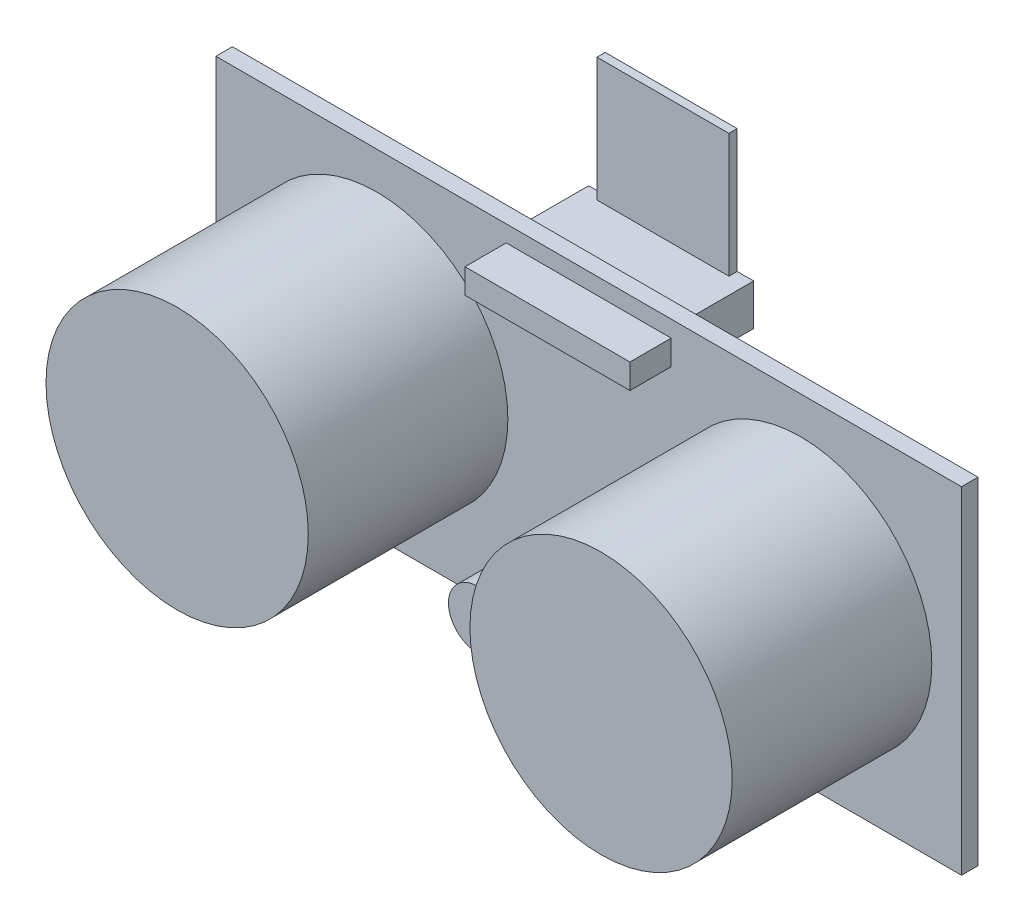
ISO-10303-21;
HEADER;
FILE_DESCRIPTION(('STEP AP214'),'2;1');
FILE_NAME('part.step','',(''),(''),'','','');
FILE_SCHEMA(('AUTOMOTIVE_DESIGN { 1 0 10303 214 1 1 1 1 }'));
ENDSEC;
DATA;
#1=APPLICATION_CONTEXT('core data for automotive mechanical design processes');
#2=APPLICATION_PROTOCOL_DEFINITION('international standard','automotive_design',2000,#1);
#3=PRODUCT_CONTEXT('',#1,'mechanical');
#4=PRODUCT('Part','Part','',(#3));
#5=PRODUCT_RELATED_PRODUCT_CATEGORY('part','',(#4));
#6=PRODUCT_DEFINITION_FORMATION('','',#4);
#7=PRODUCT_DEFINITION_CONTEXT('part definition',#1,'design');
#8=PRODUCT_DEFINITION('design','',#6,#7);
#9=PRODUCT_DEFINITION_SHAPE('','',#8);
#10=(LENGTH_UNIT() NAMED_UNIT(*) SI_UNIT(.MILLI.,.METRE.));
#11=(NAMED_UNIT(*) PLANE_ANGLE_UNIT() SI_UNIT($,.RADIAN.));
#12=(NAMED_UNIT(*) SI_UNIT($,.STERADIAN.) SOLID_ANGLE_UNIT());
#13=UNCERTAINTY_MEASURE_WITH_UNIT(LENGTH_MEASURE(1.E-05),#10,'distance_accuracy_value','');
#14=(GEOMETRIC_REPRESENTATION_CONTEXT(3) GLOBAL_UNCERTAINTY_ASSIGNED_CONTEXT((#13)) GLOBAL_UNIT_ASSIGNED_CONTEXT((#10,
#11,#12)) REPRESENTATION_CONTEXT('',''));
#15=CARTESIAN_POINT('',(0.,0.,0.));
#16=DIRECTION('',(0.,0.,1.));
#17=DIRECTION('',(1.,0.,0.));
#18=AXIS2_PLACEMENT_3D('',#15,#16,#17);
#19=CARTESIAN_POINT('',(0.,0.,1.));
#20=DIRECTION('',(0.,0.,-1.));
#21=DIRECTION('',(-1.,0.,0.));
#22=AXIS2_PLACEMENT_3D('',#19,#20,#21);
#23=PLANE('',#22);
#24=DIRECTION('',(1.,0.,0.));
#25=VECTOR('',#24,1.);
#26=CARTESIAN_POINT('',(27.6,0.500000000000007,1.));
#27=LINE('',#26,#25);
#28=CARTESIAN_POINT('',(19.35,0.500000000000006,1.));
#29=VERTEX_POINT('',#28);
#30=CARTESIAN_POINT('',(25.85,0.500000000000007,1.));
#31=VERTEX_POINT('',#30);
#32=EDGE_CURVE('E315',#29,#31,#27,.T.);
#33=ORIENTED_EDGE('',*,*,#32,.F.);
#34=CARTESIAN_POINT('',(19.35,2.25000000000001,1.));
#35=DIRECTION('',(0.,0.,-1.));
#36=DIRECTION('',(-1.,0.,0.));
#37=AXIS2_PLACEMENT_3D('',#34,#35,#36);
#38=CIRCLE('',#37,1.75);
#39=CARTESIAN_POINT('',(17.6,2.25000000000001,1.));
#40=VERTEX_POINT('',#39);
#41=EDGE_CURVE('E11',#29,#40,#38,.T.);
#42=ORIENTED_EDGE('',*,*,#41,.T.);
#43=CARTESIAN_POINT('',(19.35,2.25000000000001,1.));
#44=DIRECTION('',(0.,0.,-1.));
#45=DIRECTION('',(-1.,0.,0.));
#46=AXIS2_PLACEMENT_3D('',#43,#44,#45);
#47=CIRCLE('',#46,1.75);
#48=CARTESIAN_POINT('',(19.35,4.00000000000001,1.));
#49=VERTEX_POINT('',#48);
#50=EDGE_CURVE('E54',#40,#49,#47,.T.);
#51=ORIENTED_EDGE('',*,*,#50,.T.);
#52=DIRECTION('',(-1.,0.,0.));
#53=VECTOR('',#52,1.);
#54=CARTESIAN_POINT('',(27.6,4.00000000000001,1.));
#55=LINE('',#54,#53);
#56=CARTESIAN_POINT('',(25.85,4.00000000000001,1.));
#57=VERTEX_POINT('',#56);
#58=EDGE_CURVE('E310',#57,#49,#55,.T.);
#59=ORIENTED_EDGE('',*,*,#58,.F.);
#60=CARTESIAN_POINT('',(25.85,2.25000000000001,1.));
#61=DIRECTION('',(0.,0.,-1.));
#62=DIRECTION('',(-1.,0.,0.));
#63=AXIS2_PLACEMENT_3D('',#60,#61,#62);
#64=CIRCLE('',#63,1.75);
#65=CARTESIAN_POINT('',(27.6,2.25000000000001,1.));
#66=VERTEX_POINT('',#65);
#67=EDGE_CURVE('E409',#57,#66,#64,.T.);
#68=ORIENTED_EDGE('',*,*,#67,.T.);
#69=CARTESIAN_POINT('',(25.85,2.25000000000001,1.));
#70=DIRECTION('',(0.,0.,-1.));
#71=DIRECTION('',(-1.,0.,0.));
#72=AXIS2_PLACEMENT_3D('',#69,#70,#71);
#73=CIRCLE('',#72,1.75);
#74=EDGE_CURVE('E406',#66,#31,#73,.T.);
#75=ORIENTED_EDGE('',*,*,#74,.T.);
#76=EDGE_LOOP('',(#33,#42,#51,#59,#68,#75));
#77=FACE_BOUND('',#76,.T.);
#78=CARTESIAN_POINT('',(35.45,10.2,1.));
#79=DIRECTION('',(0.,0.,-1.));
#80=DIRECTION('',(-1.,0.,0.));
#81=AXIS2_PLACEMENT_3D('',#78,#79,#80);
#82=CIRCLE('',#81,7.95);
#83=CARTESIAN_POINT('',(27.5,10.2,1.));
#84=VERTEX_POINT('',#83);
#85=EDGE_CURVE('E376',#84,#84,#82,.F.);
#86=ORIENTED_EDGE('',*,*,#85,.F.);
#87=EDGE_LOOP('',(#86));
#88=FACE_BOUND('',#87,.T.);
#89=CARTESIAN_POINT('',(9.75,10.2,1.));
#90=DIRECTION('',(0.,0.,-1.));
#91=DIRECTION('',(-1.,0.,0.));
#92=AXIS2_PLACEMENT_3D('',#89,#90,#91);
#93=CIRCLE('',#92,7.95);
#94=CARTESIAN_POINT('',(1.8,10.2,1.));
#95=VERTEX_POINT('',#94);
#96=EDGE_CURVE('E372',#95,#95,#93,.F.);
#97=ORIENTED_EDGE('',*,*,#96,.F.);
#98=EDGE_LOOP('',(#97));
#99=FACE_BOUND('',#98,.T.);
#100=DIRECTION('',(0.,-1.,0.));
#101=VECTOR('',#100,1.);
#102=CARTESIAN_POINT('',(0.,0.,1.));
#103=LINE('',#102,#101);
#104=CARTESIAN_POINT('',(0.,20.4,1.));
#105=VERTEX_POINT('',#104);
#106=CARTESIAN_POINT('',(0.,0.,1.));
#107=VERTEX_POINT('',#106);
#108=EDGE_CURVE('E331',#105,#107,#103,.T.);
#109=ORIENTED_EDGE('',*,*,#108,.T.);
#110=DIRECTION('',(1.,0.,0.));
#111=VECTOR('',#110,1.);
#112=CARTESIAN_POINT('',(0.,0.,1.));
#113=LINE('',#112,#111);
#114=CARTESIAN_POINT('',(45.2,0.,1.));
#115=VERTEX_POINT('',#114);
#116=EDGE_CURVE('E335',#107,#115,#113,.T.);
#117=ORIENTED_EDGE('',*,*,#116,.T.);
#118=DIRECTION('',(0.,1.,0.));
#119=VECTOR('',#118,1.);
#120=CARTESIAN_POINT('',(45.2,0.,1.));
#121=LINE('',#120,#119);
#122=CARTESIAN_POINT('',(45.2,20.4,1.));
#123=VERTEX_POINT('',#122);
#124=EDGE_CURVE('E339',#115,#123,#121,.T.);
#125=ORIENTED_EDGE('',*,*,#124,.T.);
#126=DIRECTION('',(-1.,0.,0.));
#127=VECTOR('',#126,1.);
#128=CARTESIAN_POINT('',(0.,20.4,1.));
#129=LINE('',#128,#127);
#130=EDGE_CURVE('E342',#123,#105,#129,.T.);
#131=ORIENTED_EDGE('',*,*,#130,.T.);
#132=EDGE_LOOP('',(#109,#117,#125,#131));
#133=FACE_BOUND('',#132,.T.);
#134=DIRECTION('',(0.,1.,0.));
#135=VECTOR('',#134,1.);
#136=CARTESIAN_POINT('',(27.6,19.4,1.));
#137=LINE('',#136,#135);
#138=CARTESIAN_POINT('',(27.6,17.9,1.));
#139=VERTEX_POINT('',#138);
#140=CARTESIAN_POINT('',(27.6,19.4,1.));
#141=VERTEX_POINT('',#140);
#142=EDGE_CURVE('E217',#139,#141,#137,.T.);
#143=ORIENTED_EDGE('',*,*,#142,.F.);
#144=DIRECTION('',(1.,0.,0.));
#145=VECTOR('',#144,1.);
#146=CARTESIAN_POINT('',(17.6,17.9,1.));
#147=LINE('',#146,#145);
#148=CARTESIAN_POINT('',(17.6,17.9,1.));
#149=VERTEX_POINT('',#148);
#150=EDGE_CURVE('E214',#149,#139,#147,.T.);
#151=ORIENTED_EDGE('',*,*,#150,.F.);
#152=DIRECTION('',(0.,-1.,0.));
#153=VECTOR('',#152,1.);
#154=CARTESIAN_POINT('',(17.6,19.4,1.));
#155=LINE('',#154,#153);
#156=CARTESIAN_POINT('',(17.6,19.4,1.));
#157=VERTEX_POINT('',#156);
#158=EDGE_CURVE('E67',#157,#149,#155,.T.);
#159=ORIENTED_EDGE('',*,*,#158,.F.);
#160=DIRECTION('',(-1.,0.,0.));
#161=VECTOR('',#160,1.);
#162=CARTESIAN_POINT('',(17.6,19.4,1.));
#163=LINE('',#162,#161);
#164=EDGE_CURVE('E62',#141,#157,#163,.T.);
#165=ORIENTED_EDGE('',*,*,#164,.F.);
#166=EDGE_LOOP('',(#143,#151,#159,#165));
#167=FACE_BOUND('',#166,.T.);
#168=ADVANCED_FACE('F44',(#77,#88,#99,#133,#167),#23,.F.);
#169=CARTESIAN_POINT('',(27.6,19.9014399541796,-4.));
#170=DIRECTION('',(0.,-1.,0.));
#171=DIRECTION('',(0.,0.,-1.));
#172=AXIS2_PLACEMENT_3D('',#169,#170,#171);
#173=PLANE('',#172);
#174=DIRECTION('',(0.,0.,-1.));
#175=VECTOR('',#174,1.);
#176=CARTESIAN_POINT('',(26.6,19.9014399541796,-3.5));
#177=LINE('',#176,#175);
#178=CARTESIAN_POINT('',(26.6,19.9014399541796,-3.5));
#179=VERTEX_POINT('',#178);
#180=CARTESIAN_POINT('',(26.6,19.9014399541796,-4.));
#181=VERTEX_POINT('',#180);
#182=EDGE_CURVE('E219',#179,#181,#177,.T.);
#183=ORIENTED_EDGE('',*,*,#182,.F.);
#184=DIRECTION('',(1.,0.,0.));
#185=VECTOR('',#184,1.);
#186=CARTESIAN_POINT('',(18.6,19.9014399541796,-3.5));
#187=LINE('',#186,#185);
#188=CARTESIAN_POINT('',(18.6,19.9014399541796,-3.5));
#189=VERTEX_POINT('',#188);
#190=EDGE_CURVE('E234',#189,#179,#187,.T.);
#191=ORIENTED_EDGE('',*,*,#190,.F.);
#192=DIRECTION('',(0.,0.,1.));
#193=VECTOR('',#192,1.);
#194=CARTESIAN_POINT('',(18.6,19.9014399541796,-3.5));
#195=LINE('',#194,#193);
#196=CARTESIAN_POINT('',(18.6,19.9014399541796,-4.));
#197=VERTEX_POINT('',#196);
#198=EDGE_CURVE('E223',#197,#189,#195,.T.);
#199=ORIENTED_EDGE('',*,*,#198,.F.);
#200=DIRECTION('',(1.,0.,0.));
#201=VECTOR('',#200,1.);
#202=CARTESIAN_POINT('',(27.6,19.9014399541796,-4.));
#203=LINE('',#202,#201);
#204=CARTESIAN_POINT('',(17.6,19.9014399541796,-4.));
#205=VERTEX_POINT('',#204);
#206=EDGE_CURVE('E269',#205,#197,#203,.T.);
#207=ORIENTED_EDGE('',*,*,#206,.F.);
#208=DIRECTION('',(0.,0.,1.));
#209=VECTOR('',#208,1.);
#210=CARTESIAN_POINT('',(17.6,19.9014399541796,-4.));
#211=LINE('',#210,#209);
#212=CARTESIAN_POINT('',(17.6,19.9014399541796,0.));
#213=VERTEX_POINT('',#212);
#214=EDGE_CURVE('E302',#205,#213,#211,.T.);
#215=ORIENTED_EDGE('',*,*,#214,.T.);
#216=DIRECTION('',(1.,0.,0.));
#217=VECTOR('',#216,1.);
#218=CARTESIAN_POINT('',(27.6,19.9014399541796,0.));
#219=LINE('',#218,#217);
#220=CARTESIAN_POINT('',(27.6,19.9014399541796,0.));
#221=VERTEX_POINT('',#220);
#222=EDGE_CURVE('E283',#213,#221,#219,.T.);
#223=ORIENTED_EDGE('',*,*,#222,.T.);
#224=DIRECTION('',(0.,0.,1.));
#225=VECTOR('',#224,1.);
#226=CARTESIAN_POINT('',(27.6,19.9014399541796,-4.));
#227=LINE('',#226,#225);
#228=CARTESIAN_POINT('',(27.6,19.9014399541796,-4.));
#229=VERTEX_POINT('',#228);
#230=EDGE_CURVE('E298',#229,#221,#227,.T.);
#231=ORIENTED_EDGE('',*,*,#230,.F.);
#232=EDGE_CURVE('E267',#181,#229,#203,.T.);
#233=ORIENTED_EDGE('',*,*,#232,.F.);
#234=EDGE_LOOP('',(#183,#191,#199,#207,#215,#223,#231,#233));
#235=FACE_BOUND('',#234,.T.);
#236=ADVANCED_FACE('F449',(#235),#173,.F.);
#237=CARTESIAN_POINT('',(0.,0.,0.));
#238=DIRECTION('',(0.,0.,-1.));
#239=DIRECTION('',(-1.,0.,0.));
#240=AXIS2_PLACEMENT_3D('',#237,#238,#239);
#241=PLANE('',#240);
#242=DIRECTION('',(0.,-1.,0.));
#243=VECTOR('',#242,1.);
#244=CARTESIAN_POINT('',(0.,0.,0.));
#245=LINE('',#244,#243);
#246=CARTESIAN_POINT('',(0.,20.4,0.));
#247=VERTEX_POINT('',#246);
#248=CARTESIAN_POINT('',(0.,0.,0.));
#249=VERTEX_POINT('',#248);
#250=EDGE_CURVE('E330',#247,#249,#245,.T.);
#251=ORIENTED_EDGE('',*,*,#250,.F.);
#252=DIRECTION('',(-1.,0.,0.));
#253=VECTOR('',#252,1.);
#254=CARTESIAN_POINT('',(0.,20.4,0.));
#255=LINE('',#254,#253);
#256=CARTESIAN_POINT('',(45.2,20.4,0.));
#257=VERTEX_POINT('',#256);
#258=EDGE_CURVE('E336',#257,#247,#255,.T.);
#259=ORIENTED_EDGE('',*,*,#258,.F.);
#260=DIRECTION('',(0.,1.,0.));
#261=VECTOR('',#260,1.);
#262=CARTESIAN_POINT('',(45.2,0.,0.));
#263=LINE('',#262,#261);
#264=CARTESIAN_POINT('',(45.2,0.,0.));
#265=VERTEX_POINT('',#264);
#266=EDGE_CURVE('E352',#265,#257,#263,.T.);
#267=ORIENTED_EDGE('',*,*,#266,.F.);
#268=DIRECTION('',(1.,0.,0.));
#269=VECTOR('',#268,1.);
#270=CARTESIAN_POINT('',(0.,0.,0.));
#271=LINE('',#270,#269);
#272=EDGE_CURVE('E349',#249,#265,#271,.T.);
#273=ORIENTED_EDGE('',*,*,#272,.F.);
#274=EDGE_LOOP('',(#251,#259,#267,#273));
#275=FACE_BOUND('',#274,.T.);
#276=ORIENTED_EDGE('',*,*,#222,.F.);
#277=DIRECTION('',(0.,1.,0.));
#278=VECTOR('',#277,1.);
#279=CARTESIAN_POINT('',(17.6,19.9014399541796,0.));
#280=LINE('',#279,#278);
#281=CARTESIAN_POINT('',(17.6,17.4014399541796,0.));
#282=VERTEX_POINT('',#281);
#283=EDGE_CURVE('E262',#282,#213,#280,.T.);
#284=ORIENTED_EDGE('',*,*,#283,.F.);
#285=DIRECTION('',(-1.,0.,0.));
#286=VECTOR('',#285,1.);
#287=CARTESIAN_POINT('',(27.6,17.4014399541796,0.));
#288=LINE('',#287,#286);
#289=CARTESIAN_POINT('',(27.6,17.4014399541796,0.));
#290=VERTEX_POINT('',#289);
#291=EDGE_CURVE('E268',#290,#282,#288,.T.);
#292=ORIENTED_EDGE('',*,*,#291,.F.);
#293=DIRECTION('',(0.,-1.,0.));
#294=VECTOR('',#293,1.);
#295=CARTESIAN_POINT('',(27.6,19.9014399541796,0.));
#296=LINE('',#295,#294);
#297=EDGE_CURVE('E286',#221,#290,#296,.T.);
#298=ORIENTED_EDGE('',*,*,#297,.F.);
#299=EDGE_LOOP('',(#276,#284,#292,#298));
#300=FACE_BOUND('',#299,.T.);
#301=ADVANCED_FACE('F523',(#275,#300),#241,.T.);
#302=CARTESIAN_POINT('',(0.,0.,1.));
#303=DIRECTION('',(1.,0.,0.));
#304=DIRECTION('',(0.,0.,-1.));
#305=AXIS2_PLACEMENT_3D('',#302,#303,#304);
#306=PLANE('',#305);
#307=ORIENTED_EDGE('',*,*,#250,.T.);
#308=DIRECTION('',(0.,0.,-1.));
#309=VECTOR('',#308,1.);
#310=CARTESIAN_POINT('',(0.,0.,1.));
#311=LINE('',#310,#309);
#312=EDGE_CURVE('E368',#107,#249,#311,.T.);
#313=ORIENTED_EDGE('',*,*,#312,.F.);
#314=ORIENTED_EDGE('',*,*,#108,.F.);
#315=DIRECTION('',(0.,0.,-1.));
#316=VECTOR('',#315,1.);
#317=CARTESIAN_POINT('',(0.,20.4,1.));
#318=LINE('',#317,#316);
#319=EDGE_CURVE('E345',#105,#247,#318,.T.);
#320=ORIENTED_EDGE('',*,*,#319,.T.);
#321=EDGE_LOOP('',(#307,#313,#314,#320));
#322=FACE_BOUND('',#321,.T.);
#323=ADVANCED_FACE('F553',(#322),#306,.F.);
#324=CARTESIAN_POINT('',(0.,0.,1.));
#325=DIRECTION('',(0.,1.,0.));
#326=DIRECTION('',(0.,0.,1.));
#327=AXIS2_PLACEMENT_3D('',#324,#325,#326);
#328=PLANE('',#327);
#329=ORIENTED_EDGE('',*,*,#272,.T.);
#330=DIRECTION('',(0.,0.,-1.));
#331=VECTOR('',#330,1.);
#332=CARTESIAN_POINT('',(45.2,0.,1.));
#333=LINE('',#332,#331);
#334=EDGE_CURVE('E364',#115,#265,#333,.T.);
#335=ORIENTED_EDGE('',*,*,#334,.F.);
#336=ORIENTED_EDGE('',*,*,#116,.F.);
#337=ORIENTED_EDGE('',*,*,#312,.T.);
#338=EDGE_LOOP('',(#329,#335,#336,#337));
#339=FACE_BOUND('',#338,.T.);
#340=ADVANCED_FACE('F561',(#339),#328,.F.);
#341=CARTESIAN_POINT('',(45.2,0.,1.));
#342=DIRECTION('',(-1.,0.,0.));
#343=DIRECTION('',(0.,0.,1.));
#344=AXIS2_PLACEMENT_3D('',#341,#342,#343);
#345=PLANE('',#344);
#346=ORIENTED_EDGE('',*,*,#266,.T.);
#347=DIRECTION('',(0.,0.,-1.));
#348=VECTOR('',#347,1.);
#349=CARTESIAN_POINT('',(45.2,20.4,1.));
#350=LINE('',#349,#348);
#351=EDGE_CURVE('E360',#123,#257,#350,.T.);
#352=ORIENTED_EDGE('',*,*,#351,.F.);
#353=ORIENTED_EDGE('',*,*,#124,.F.);
#354=ORIENTED_EDGE('',*,*,#334,.T.);
#355=EDGE_LOOP('',(#346,#352,#353,#354));
#356=FACE_BOUND('',#355,.T.);
#357=ADVANCED_FACE('F557',(#356),#345,.F.);
#358=CARTESIAN_POINT('',(0.,20.4,1.));
#359=DIRECTION('',(0.,-1.,0.));
#360=DIRECTION('',(0.,0.,-1.));
#361=AXIS2_PLACEMENT_3D('',#358,#359,#360);
#362=PLANE('',#361);
#363=ORIENTED_EDGE('',*,*,#258,.T.);
#364=ORIENTED_EDGE('',*,*,#319,.F.);
#365=ORIENTED_EDGE('',*,*,#130,.F.);
#366=ORIENTED_EDGE('',*,*,#351,.T.);
#367=EDGE_LOOP('',(#363,#364,#365,#366));
#368=FACE_BOUND('',#367,.T.);
#369=ADVANCED_FACE('F548',(#368),#362,.F.);
#370=CARTESIAN_POINT('',(9.75,10.2,13.1));
#371=DIRECTION('',(0.,0.,-1.));
#372=DIRECTION('',(-1.,0.,0.));
#373=AXIS2_PLACEMENT_3D('',#370,#371,#372);
#374=CYLINDRICAL_SURFACE('',#373,7.95);
#375=CARTESIAN_POINT('',(9.75,10.2,13.1));
#376=DIRECTION('',(0.,0.,1.));
#377=DIRECTION('',(1.,0.,0.));
#378=AXIS2_PLACEMENT_3D('',#375,#376,#377);
#379=CIRCLE('',#378,7.95);
#380=CARTESIAN_POINT('',(17.7,10.2,13.1));
#381=VERTEX_POINT('',#380);
#382=EDGE_CURVE('E326',#381,#381,#379,.T.);
#383=ORIENTED_EDGE('',*,*,#382,.F.);
#384=EDGE_LOOP('',(#383));
#385=FACE_BOUND('',#384,.T.);
#386=ORIENTED_EDGE('',*,*,#96,.T.);
#387=EDGE_LOOP('',(#386));
#388=FACE_BOUND('',#387,.T.);
#389=ADVANCED_FACE('F545',(#385,#388),#374,.T.);
#390=CARTESIAN_POINT('',(9.75,10.2,13.1));
#391=DIRECTION('',(0.,0.,1.));
#392=DIRECTION('',(1.,0.,0.));
#393=AXIS2_PLACEMENT_3D('',#390,#391,#392);
#394=PLANE('',#393);
#395=ORIENTED_EDGE('',*,*,#382,.T.);
#396=EDGE_LOOP('',(#395));
#397=FACE_BOUND('',#396,.T.);
#398=ADVANCED_FACE('F538',(#397),#394,.T.);
#399=CARTESIAN_POINT('',(35.45,10.2,13.1));
#400=DIRECTION('',(0.,0.,-1.));
#401=DIRECTION('',(-1.,0.,0.));
#402=AXIS2_PLACEMENT_3D('',#399,#400,#401);
#403=CYLINDRICAL_SURFACE('',#402,7.95);
#404=CARTESIAN_POINT('',(35.45,10.2,13.1));
#405=DIRECTION('',(0.,0.,1.));
#406=DIRECTION('',(-1.,0.,0.));
#407=AXIS2_PLACEMENT_3D('',#404,#405,#406);
#408=CIRCLE('',#407,7.95);
#409=CARTESIAN_POINT('',(27.5,10.2,13.1));
#410=VERTEX_POINT('',#409);
#411=EDGE_CURVE('E314',#410,#410,#408,.T.);
#412=ORIENTED_EDGE('',*,*,#411,.F.);
#413=EDGE_LOOP('',(#412));
#414=FACE_BOUND('',#413,.T.);
#415=ORIENTED_EDGE('',*,*,#85,.T.);
#416=EDGE_LOOP('',(#415));
#417=FACE_BOUND('',#416,.T.);
#418=ADVANCED_FACE('F535',(#414,#417),#403,.T.);
#419=CARTESIAN_POINT('',(35.45,10.2,13.1));
#420=DIRECTION('',(0.,0.,-1.));
#421=DIRECTION('',(-1.,0.,0.));
#422=AXIS2_PLACEMENT_3D('',#419,#420,#421);
#423=PLANE('',#422);
#424=ORIENTED_EDGE('',*,*,#411,.T.);
#425=EDGE_LOOP('',(#424));
#426=FACE_BOUND('',#425,.T.);
#427=ADVANCED_FACE('F534',(#426),#423,.F.);
#428=CARTESIAN_POINT('',(27.6,0.500000000000007,4.5));
#429=DIRECTION('',(0.,1.,0.));
#430=DIRECTION('',(-1.,0.,0.));
#431=AXIS2_PLACEMENT_3D('',#428,#429,#430);
#432=PLANE('',#431);
#433=ORIENTED_EDGE('',*,*,#32,.T.);
#434=DIRECTION('',(0.,0.,-1.));
#435=VECTOR('',#434,1.);
#436=CARTESIAN_POINT('',(25.85,0.500000000000007,4.5));
#437=LINE('',#436,#435);
#438=CARTESIAN_POINT('',(25.85,0.500000000000007,4.5));
#439=VERTEX_POINT('',#438);
#440=EDGE_CURVE('E383',#31,#439,#437,.F.);
#441=ORIENTED_EDGE('',*,*,#440,.T.);
#442=DIRECTION('',(1.,0.,0.));
#443=VECTOR('',#442,1.);
#444=CARTESIAN_POINT('',(27.6,0.500000000000007,4.5));
#445=LINE('',#444,#443);
#446=CARTESIAN_POINT('',(19.35,0.500000000000006,4.5));
#447=VERTEX_POINT('',#446);
#448=EDGE_CURVE('E305',#447,#439,#445,.T.);
#449=ORIENTED_EDGE('',*,*,#448,.F.);
#450=DIRECTION('',(0.,0.,-1.));
#451=VECTOR('',#450,1.);
#452=CARTESIAN_POINT('',(19.35,0.500000000000006,4.5));
#453=LINE('',#452,#451);
#454=EDGE_CURVE('E380',#447,#29,#453,.T.);
#455=ORIENTED_EDGE('',*,*,#454,.T.);
#456=EDGE_LOOP('',(#433,#441,#449,#455));
#457=FACE_BOUND('',#456,.T.);
#458=ADVANCED_FACE('F433',(#457),#432,.F.);
#459=CARTESIAN_POINT('',(27.6,4.00000000000001,4.5));
#460=DIRECTION('',(0.,-1.,0.));
#461=DIRECTION('',(1.,0.,0.));
#462=AXIS2_PLACEMENT_3D('',#459,#460,#461);
#463=PLANE('',#462);
#464=DIRECTION('',(-1.,0.,0.));
#465=VECTOR('',#464,1.);
#466=CARTESIAN_POINT('',(27.6,4.00000000000001,4.5));
#467=LINE('',#466,#465);
#468=CARTESIAN_POINT('',(25.85,4.00000000000001,4.5));
#469=VERTEX_POINT('',#468);
#470=CARTESIAN_POINT('',(19.35,4.00000000000001,4.5));
#471=VERTEX_POINT('',#470);
#472=EDGE_CURVE('E309',#469,#471,#467,.T.);
#473=ORIENTED_EDGE('',*,*,#472,.F.);
#474=DIRECTION('',(0.,0.,-1.));
#475=VECTOR('',#474,1.);
#476=CARTESIAN_POINT('',(25.85,4.00000000000001,4.5));
#477=LINE('',#476,#475);
#478=EDGE_CURVE('E403',#469,#57,#477,.T.);
#479=ORIENTED_EDGE('',*,*,#478,.T.);
#480=ORIENTED_EDGE('',*,*,#58,.T.);
#481=DIRECTION('',(0.,0.,-1.));
#482=VECTOR('',#481,1.);
#483=CARTESIAN_POINT('',(19.35,4.00000000000001,4.5));
#484=LINE('',#483,#482);
#485=EDGE_CURVE('E399',#49,#471,#484,.F.);
#486=ORIENTED_EDGE('',*,*,#485,.T.);
#487=EDGE_LOOP('',(#473,#479,#480,#486));
#488=FACE_BOUND('',#487,.T.);
#489=ADVANCED_FACE('F445',(#488),#463,.F.);
#490=CARTESIAN_POINT('',(0.,0.,4.5));
#491=DIRECTION('',(0.,0.,1.));
#492=DIRECTION('',(1.,0.,0.));
#493=AXIS2_PLACEMENT_3D('',#490,#491,#492);
#494=PLANE('',#493);
#495=ORIENTED_EDGE('',*,*,#448,.T.);
#496=CARTESIAN_POINT('',(25.85,2.25000000000001,4.5));
#497=DIRECTION('',(0.,0.,1.));
#498=DIRECTION('',(1.,0.,0.));
#499=AXIS2_PLACEMENT_3D('',#496,#497,#498);
#500=CIRCLE('',#499,1.75);
#501=CARTESIAN_POINT('',(27.6,2.25000000000001,4.5));
#502=VERTEX_POINT('',#501);
#503=EDGE_CURVE('E396',#439,#502,#500,.T.);
#504=ORIENTED_EDGE('',*,*,#503,.T.);
#505=CARTESIAN_POINT('',(25.85,2.25000000000001,4.5));
#506=DIRECTION('',(0.,0.,1.));
#507=DIRECTION('',(1.,0.,0.));
#508=AXIS2_PLACEMENT_3D('',#505,#506,#507);
#509=CIRCLE('',#508,1.75);
#510=EDGE_CURVE('E393',#502,#469,#509,.T.);
#511=ORIENTED_EDGE('',*,*,#510,.T.);
#512=ORIENTED_EDGE('',*,*,#472,.T.);
#513=CARTESIAN_POINT('',(19.35,2.25000000000001,4.5));
#514=DIRECTION('',(0.,0.,1.));
#515=DIRECTION('',(1.,0.,0.));
#516=AXIS2_PLACEMENT_3D('',#513,#514,#515);
#517=CIRCLE('',#516,1.75);
#518=CARTESIAN_POINT('',(17.6,2.25000000000001,4.5));
#519=VERTEX_POINT('',#518);
#520=EDGE_CURVE('E390',#471,#519,#517,.T.);
#521=ORIENTED_EDGE('',*,*,#520,.T.);
#522=CARTESIAN_POINT('',(19.35,2.25000000000001,4.5));
#523=DIRECTION('',(0.,0.,1.));
#524=DIRECTION('',(1.,0.,0.));
#525=AXIS2_PLACEMENT_3D('',#522,#523,#524);
#526=CIRCLE('',#525,1.75);
#527=EDGE_CURVE('E387',#519,#447,#526,.T.);
#528=ORIENTED_EDGE('',*,*,#527,.T.);
#529=EDGE_LOOP('',(#495,#504,#511,#512,#521,#528));
#530=FACE_BOUND('',#529,.T.);
#531=ADVANCED_FACE('F431',(#530),#494,.T.);
#532=CARTESIAN_POINT('',(25.85,2.25000000000001,4.5));
#533=DIRECTION('',(0.,0.,-1.));
#534=DIRECTION('',(-1.,0.,0.));
#535=AXIS2_PLACEMENT_3D('',#532,#533,#534);
#536=CYLINDRICAL_SURFACE('',#535,1.75);
#537=ORIENTED_EDGE('',*,*,#478,.F.);
#538=ORIENTED_EDGE('',*,*,#510,.F.);
#539=DIRECTION('',(0.,0.,-1.));
#540=VECTOR('',#539,1.);
#541=CARTESIAN_POINT('',(27.6,2.25000000000001,4.5));
#542=LINE('',#541,#540);
#543=EDGE_CURVE('E319',#66,#502,#542,.F.);
#544=ORIENTED_EDGE('',*,*,#543,.F.);
#545=ORIENTED_EDGE('',*,*,#67,.F.);
#546=EDGE_LOOP('',(#537,#538,#544,#545));
#547=FACE_BOUND('',#546,.T.);
#548=ADVANCED_FACE('F441',(#547),#536,.T.);
#549=CARTESIAN_POINT('',(25.85,2.25000000000001,4.5));
#550=DIRECTION('',(0.,0.,-1.));
#551=DIRECTION('',(-1.,0.,0.));
#552=AXIS2_PLACEMENT_3D('',#549,#550,#551);
#553=CYLINDRICAL_SURFACE('',#552,1.75);
#554=ORIENTED_EDGE('',*,*,#503,.F.);
#555=ORIENTED_EDGE('',*,*,#440,.F.);
#556=ORIENTED_EDGE('',*,*,#74,.F.);
#557=ORIENTED_EDGE('',*,*,#543,.T.);
#558=EDGE_LOOP('',(#554,#555,#556,#557));
#559=FACE_BOUND('',#558,.T.);
#560=ADVANCED_FACE('F436',(#559),#553,.T.);
#561=CARTESIAN_POINT('',(19.35,2.25000000000001,4.5));
#562=DIRECTION('',(0.,0.,-1.));
#563=DIRECTION('',(-1.,0.,0.));
#564=AXIS2_PLACEMENT_3D('',#561,#562,#563);
#565=CYLINDRICAL_SURFACE('',#564,1.75);
#566=ORIENTED_EDGE('',*,*,#454,.F.);
#567=ORIENTED_EDGE('',*,*,#527,.F.);
#568=DIRECTION('',(0.,0.,-1.));
#569=VECTOR('',#568,1.);
#570=CARTESIAN_POINT('',(17.6,2.25000000000001,4.5));
#571=LINE('',#570,#569);
#572=EDGE_CURVE('E48',#40,#519,#571,.F.);
#573=ORIENTED_EDGE('',*,*,#572,.F.);
#574=ORIENTED_EDGE('',*,*,#41,.F.);
#575=EDGE_LOOP('',(#566,#567,#573,#574));
#576=FACE_BOUND('',#575,.T.);
#577=ADVANCED_FACE('F46',(#576),#565,.T.);
#578=CARTESIAN_POINT('',(19.35,2.25000000000001,4.5));
#579=DIRECTION('',(0.,0.,-1.));
#580=DIRECTION('',(-1.,0.,0.));
#581=AXIS2_PLACEMENT_3D('',#578,#579,#580);
#582=CYLINDRICAL_SURFACE('',#581,1.75);
#583=ORIENTED_EDGE('',*,*,#520,.F.);
#584=ORIENTED_EDGE('',*,*,#485,.F.);
#585=ORIENTED_EDGE('',*,*,#50,.F.);
#586=ORIENTED_EDGE('',*,*,#572,.T.);
#587=EDGE_LOOP('',(#583,#584,#585,#586));
#588=FACE_BOUND('',#587,.T.);
#589=ADVANCED_FACE('F423',(#588),#582,.T.);
#590=CARTESIAN_POINT('',(17.6,19.9014399541796,-4.));
#591=DIRECTION('',(1.,0.,0.));
#592=DIRECTION('',(0.,0.,-1.));
#593=AXIS2_PLACEMENT_3D('',#590,#591,#592);
#594=PLANE('',#593);
#595=ORIENTED_EDGE('',*,*,#283,.T.);
#596=ORIENTED_EDGE('',*,*,#214,.F.);
#597=DIRECTION('',(0.,1.,0.));
#598=VECTOR('',#597,1.);
#599=CARTESIAN_POINT('',(17.6,19.9014399541796,-4.));
#600=LINE('',#599,#598);
#601=CARTESIAN_POINT('',(17.6,17.4014399541796,-4.));
#602=VERTEX_POINT('',#601);
#603=EDGE_CURVE('E263',#602,#205,#600,.T.);
#604=ORIENTED_EDGE('',*,*,#603,.F.);
#605=DIRECTION('',(0.,0.,1.));
#606=VECTOR('',#605,1.);
#607=CARTESIAN_POINT('',(17.6,17.4014399541796,-4.));
#608=LINE('',#607,#606);
#609=EDGE_CURVE('E279',#602,#282,#608,.T.);
#610=ORIENTED_EDGE('',*,*,#609,.T.);
#611=EDGE_LOOP('',(#595,#596,#604,#610));
#612=FACE_BOUND('',#611,.T.);
#613=ADVANCED_FACE('F519',(#612),#594,.F.);
#614=CARTESIAN_POINT('',(27.6,19.9014399541796,-4.));
#615=DIRECTION('',(-1.,0.,0.));
#616=DIRECTION('',(0.,0.,1.));
#617=AXIS2_PLACEMENT_3D('',#614,#615,#616);
#618=PLANE('',#617);
#619=ORIENTED_EDGE('',*,*,#297,.T.);
#620=DIRECTION('',(0.,0.,1.));
#621=VECTOR('',#620,1.);
#622=CARTESIAN_POINT('',(27.6,17.4014399541796,-4.));
#623=LINE('',#622,#621);
#624=CARTESIAN_POINT('',(27.6,17.4014399541796,-4.));
#625=VERTEX_POINT('',#624);
#626=EDGE_CURVE('E295',#625,#290,#623,.T.);
#627=ORIENTED_EDGE('',*,*,#626,.F.);
#628=DIRECTION('',(0.,-1.,0.));
#629=VECTOR('',#628,1.);
#630=CARTESIAN_POINT('',(27.6,19.9014399541796,-4.));
#631=LINE('',#630,#629);
#632=EDGE_CURVE('E273',#229,#625,#631,.T.);
#633=ORIENTED_EDGE('',*,*,#632,.F.);
#634=ORIENTED_EDGE('',*,*,#230,.T.);
#635=EDGE_LOOP('',(#619,#627,#633,#634));
#636=FACE_BOUND('',#635,.T.);
#637=ADVANCED_FACE('F515',(#636),#618,.F.);
#638=CARTESIAN_POINT('',(27.6,17.4014399541796,-4.));
#639=DIRECTION('',(0.,1.,0.));
#640=DIRECTION('',(0.,0.,1.));
#641=AXIS2_PLACEMENT_3D('',#638,#639,#640);
#642=PLANE('',#641);
#643=ORIENTED_EDGE('',*,*,#291,.T.);
#644=ORIENTED_EDGE('',*,*,#609,.F.);
#645=DIRECTION('',(-1.,0.,0.));
#646=VECTOR('',#645,1.);
#647=CARTESIAN_POINT('',(27.6,17.4014399541796,-4.));
#648=LINE('',#647,#646);
#649=EDGE_CURVE('E276',#625,#602,#648,.T.);
#650=ORIENTED_EDGE('',*,*,#649,.F.);
#651=ORIENTED_EDGE('',*,*,#626,.T.);
#652=EDGE_LOOP('',(#643,#644,#650,#651));
#653=FACE_BOUND('',#652,.T.);
#654=ADVANCED_FACE('F511',(#653),#642,.F.);
#655=CARTESIAN_POINT('',(0.,0.,-4.));
#656=DIRECTION('',(0.,0.,-1.));
#657=DIRECTION('',(-1.,0.,0.));
#658=AXIS2_PLACEMENT_3D('',#655,#656,#657);
#659=PLANE('',#658);
#660=ORIENTED_EDGE('',*,*,#603,.T.);
#661=ORIENTED_EDGE('',*,*,#206,.T.);
#662=DIRECTION('',(0.,-1.,0.));
#663=VECTOR('',#662,1.);
#664=CARTESIAN_POINT('',(18.6,27.4014399541796,-4.));
#665=LINE('',#664,#663);
#666=CARTESIAN_POINT('',(18.6,27.4014399541796,-4.));
#667=VERTEX_POINT('',#666);
#668=EDGE_CURVE('E255',#667,#197,#665,.T.);
#669=ORIENTED_EDGE('',*,*,#668,.F.);
#670=DIRECTION('',(-1.,0.,0.));
#671=VECTOR('',#670,1.);
#672=CARTESIAN_POINT('',(18.6,27.4014399541796,-4.));
#673=LINE('',#672,#671);
#674=CARTESIAN_POINT('',(26.6,27.4014399541796,-4.));
#675=VERTEX_POINT('',#674);
#676=EDGE_CURVE('E233',#675,#667,#673,.T.);
#677=ORIENTED_EDGE('',*,*,#676,.F.);
#678=DIRECTION('',(0.,-1.,0.));
#679=VECTOR('',#678,1.);
#680=CARTESIAN_POINT('',(26.6,27.4014399541796,-4.));
#681=LINE('',#680,#679);
#682=EDGE_CURVE('E258',#675,#181,#681,.T.);
#683=ORIENTED_EDGE('',*,*,#682,.T.);
#684=ORIENTED_EDGE('',*,*,#232,.T.);
#685=ORIENTED_EDGE('',*,*,#632,.T.);
#686=ORIENTED_EDGE('',*,*,#649,.T.);
#687=EDGE_LOOP('',(#660,#661,#669,#677,#683,#684,#685,#686));
#688=FACE_BOUND('',#687,.T.);
#689=ADVANCED_FACE('F507',(#688),#659,.T.);
#690=CARTESIAN_POINT('',(26.6,27.4014399541796,-3.5));
#691=DIRECTION('',(-1.,0.,0.));
#692=DIRECTION('',(0.,0.,1.));
#693=AXIS2_PLACEMENT_3D('',#690,#691,#692);
#694=PLANE('',#693);
#695=ORIENTED_EDGE('',*,*,#182,.T.);
#696=ORIENTED_EDGE('',*,*,#682,.F.);
#697=DIRECTION('',(0.,0.,-1.));
#698=VECTOR('',#697,1.);
#699=CARTESIAN_POINT('',(26.6,27.4014399541796,-3.5));
#700=LINE('',#699,#698);
#701=CARTESIAN_POINT('',(26.6,27.4014399541796,-3.5));
#702=VERTEX_POINT('',#701);
#703=EDGE_CURVE('E229',#702,#675,#700,.T.);
#704=ORIENTED_EDGE('',*,*,#703,.F.);
#705=DIRECTION('',(0.,-1.,0.));
#706=VECTOR('',#705,1.);
#707=CARTESIAN_POINT('',(26.6,27.4014399541796,-3.5));
#708=LINE('',#707,#706);
#709=EDGE_CURVE('E242',#702,#179,#708,.T.);
#710=ORIENTED_EDGE('',*,*,#709,.T.);
#711=EDGE_LOOP('',(#695,#696,#704,#710));
#712=FACE_BOUND('',#711,.T.);
#713=ADVANCED_FACE('F503',(#712),#694,.F.);
#714=CARTESIAN_POINT('',(18.6,27.4014399541796,-3.5));
#715=DIRECTION('',(1.,0.,0.));
#716=DIRECTION('',(0.,0.,-1.));
#717=AXIS2_PLACEMENT_3D('',#714,#715,#716);
#718=PLANE('',#717);
#719=ORIENTED_EDGE('',*,*,#198,.T.);
#720=DIRECTION('',(0.,-1.,0.));
#721=VECTOR('',#720,1.);
#722=CARTESIAN_POINT('',(18.6,27.4014399541796,-3.5));
#723=LINE('',#722,#721);
#724=CARTESIAN_POINT('',(18.6,27.4014399541796,-3.5));
#725=VERTEX_POINT('',#724);
#726=EDGE_CURVE('E251',#725,#189,#723,.T.);
#727=ORIENTED_EDGE('',*,*,#726,.F.);
#728=DIRECTION('',(0.,0.,1.));
#729=VECTOR('',#728,1.);
#730=CARTESIAN_POINT('',(18.6,27.4014399541796,-3.5));
#731=LINE('',#730,#729);
#732=EDGE_CURVE('E237',#667,#725,#731,.T.);
#733=ORIENTED_EDGE('',*,*,#732,.F.);
#734=ORIENTED_EDGE('',*,*,#668,.T.);
#735=EDGE_LOOP('',(#719,#727,#733,#734));
#736=FACE_BOUND('',#735,.T.);
#737=ADVANCED_FACE('F499',(#736),#718,.F.);
#738=CARTESIAN_POINT('',(18.6,27.4014399541796,-3.5));
#739=DIRECTION('',(0.,0.,-1.));
#740=DIRECTION('',(-1.,0.,0.));
#741=AXIS2_PLACEMENT_3D('',#738,#739,#740);
#742=PLANE('',#741);
#743=ORIENTED_EDGE('',*,*,#190,.T.);
#744=ORIENTED_EDGE('',*,*,#709,.F.);
#745=DIRECTION('',(1.,0.,0.));
#746=VECTOR('',#745,1.);
#747=CARTESIAN_POINT('',(18.6,27.4014399541796,-3.5));
#748=LINE('',#747,#746);
#749=EDGE_CURVE('E240',#725,#702,#748,.T.);
#750=ORIENTED_EDGE('',*,*,#749,.F.);
#751=ORIENTED_EDGE('',*,*,#726,.T.);
#752=EDGE_LOOP('',(#743,#744,#750,#751));
#753=FACE_BOUND('',#752,.T.);
#754=ADVANCED_FACE('F495',(#753),#742,.F.);
#755=CARTESIAN_POINT('',(0.,27.4014399541796,0.));
#756=DIRECTION('',(0.,-1.,0.));
#757=DIRECTION('',(0.,0.,-1.));
#758=AXIS2_PLACEMENT_3D('',#755,#756,#757);
#759=PLANE('',#758);
#760=ORIENTED_EDGE('',*,*,#703,.T.);
#761=ORIENTED_EDGE('',*,*,#676,.T.);
#762=ORIENTED_EDGE('',*,*,#732,.T.);
#763=ORIENTED_EDGE('',*,*,#749,.T.);
#764=EDGE_LOOP('',(#760,#761,#762,#763));
#765=FACE_BOUND('',#764,.T.);
#766=ADVANCED_FACE('F492',(#765),#759,.F.);
#767=CARTESIAN_POINT('',(27.6,19.4,3.5));
#768=DIRECTION('',(-1.,0.,0.));
#769=DIRECTION('',(0.,0.,1.));
#770=AXIS2_PLACEMENT_3D('',#767,#768,#769);
#771=PLANE('',#770);
#772=ORIENTED_EDGE('',*,*,#142,.T.);
#773=DIRECTION('',(0.,0.,-1.));
#774=VECTOR('',#773,1.);
#775=CARTESIAN_POINT('',(27.6,19.4,3.5));
#776=LINE('',#775,#774);
#777=CARTESIAN_POINT('',(27.6,19.4,3.5));
#778=VERTEX_POINT('',#777);
#779=EDGE_CURVE('E196',#778,#141,#776,.T.);
#780=ORIENTED_EDGE('',*,*,#779,.F.);
#781=DIRECTION('',(0.,1.,0.));
#782=VECTOR('',#781,1.);
#783=CARTESIAN_POINT('',(27.6,19.4,3.5));
#784=LINE('',#783,#782);
#785=CARTESIAN_POINT('',(27.6,17.9,3.5));
#786=VERTEX_POINT('',#785);
#787=EDGE_CURVE('E204',#786,#778,#784,.T.);
#788=ORIENTED_EDGE('',*,*,#787,.F.);
#789=DIRECTION('',(0.,0.,-1.));
#790=VECTOR('',#789,1.);
#791=CARTESIAN_POINT('',(27.6,17.9,3.5));
#792=LINE('',#791,#790);
#793=EDGE_CURVE('E463',#786,#139,#792,.T.);
#794=ORIENTED_EDGE('',*,*,#793,.T.);
#795=EDGE_LOOP('',(#772,#780,#788,#794));
#796=FACE_BOUND('',#795,.T.);
#797=ADVANCED_FACE('F216',(#796),#771,.F.);
#798=CARTESIAN_POINT('',(17.6,19.4,3.5));
#799=DIRECTION('',(0.,-1.,0.));
#800=DIRECTION('',(0.,0.,-1.));
#801=AXIS2_PLACEMENT_3D('',#798,#799,#800);
#802=PLANE('',#801);
#803=ORIENTED_EDGE('',*,*,#164,.T.);
#804=DIRECTION('',(0.,0.,-1.));
#805=VECTOR('',#804,1.);
#806=CARTESIAN_POINT('',(17.6,19.4,3.5));
#807=LINE('',#806,#805);
#808=CARTESIAN_POINT('',(17.6,19.4,3.5));
#809=VERTEX_POINT('',#808);
#810=EDGE_CURVE('E199',#809,#157,#807,.T.);
#811=ORIENTED_EDGE('',*,*,#810,.F.);
#812=DIRECTION('',(-1.,0.,0.));
#813=VECTOR('',#812,1.);
#814=CARTESIAN_POINT('',(17.6,19.4,3.5));
#815=LINE('',#814,#813);
#816=EDGE_CURVE('E192',#778,#809,#815,.T.);
#817=ORIENTED_EDGE('',*,*,#816,.F.);
#818=ORIENTED_EDGE('',*,*,#779,.T.);
#819=EDGE_LOOP('',(#803,#811,#817,#818));
#820=FACE_BOUND('',#819,.T.);
#821=ADVANCED_FACE('F194',(#820),#802,.F.);
#822=CARTESIAN_POINT('',(17.6,19.4,3.5));
#823=DIRECTION('',(1.,0.,0.));
#824=DIRECTION('',(0.,0.,-1.));
#825=AXIS2_PLACEMENT_3D('',#822,#823,#824);
#826=PLANE('',#825);
#827=ORIENTED_EDGE('',*,*,#158,.T.);
#828=DIRECTION('',(0.,0.,-1.));
#829=VECTOR('',#828,1.);
#830=CARTESIAN_POINT('',(17.6,17.9,3.5));
#831=LINE('',#830,#829);
#832=CARTESIAN_POINT('',(17.6,17.9,3.5));
#833=VERTEX_POINT('',#832);
#834=EDGE_CURVE('E225',#833,#149,#831,.T.);
#835=ORIENTED_EDGE('',*,*,#834,.F.);
#836=DIRECTION('',(0.,-1.,0.));
#837=VECTOR('',#836,1.);
#838=CARTESIAN_POINT('',(17.6,19.4,3.5));
#839=LINE('',#838,#837);
#840=EDGE_CURVE('E203',#809,#833,#839,.T.);
#841=ORIENTED_EDGE('',*,*,#840,.F.);
#842=ORIENTED_EDGE('',*,*,#810,.T.);
#843=EDGE_LOOP('',(#827,#835,#841,#842));
#844=FACE_BOUND('',#843,.T.);
#845=ADVANCED_FACE('F479',(#844),#826,.F.);
#846=CARTESIAN_POINT('',(17.6,17.9,3.5));
#847=DIRECTION('',(0.,1.,0.));
#848=DIRECTION('',(0.,0.,1.));
#849=AXIS2_PLACEMENT_3D('',#846,#847,#848);
#850=PLANE('',#849);
#851=ORIENTED_EDGE('',*,*,#150,.T.);
#852=ORIENTED_EDGE('',*,*,#793,.F.);
#853=DIRECTION('',(1.,0.,0.));
#854=VECTOR('',#853,1.);
#855=CARTESIAN_POINT('',(17.6,17.9,3.5));
#856=LINE('',#855,#854);
#857=EDGE_CURVE('E209',#833,#786,#856,.T.);
#858=ORIENTED_EDGE('',*,*,#857,.F.);
#859=ORIENTED_EDGE('',*,*,#834,.T.);
#860=EDGE_LOOP('',(#851,#852,#858,#859));
#861=FACE_BOUND('',#860,.T.);
#862=ADVANCED_FACE('F462',(#861),#850,.F.);
#863=CARTESIAN_POINT('',(0.,0.,3.5));
#864=DIRECTION('',(0.,0.,1.));
#865=DIRECTION('',(1.,0.,0.));
#866=AXIS2_PLACEMENT_3D('',#863,#864,#865);
#867=PLANE('',#866);
#868=ORIENTED_EDGE('',*,*,#787,.T.);
#869=ORIENTED_EDGE('',*,*,#816,.T.);
#870=ORIENTED_EDGE('',*,*,#840,.T.);
#871=ORIENTED_EDGE('',*,*,#857,.T.);
#872=EDGE_LOOP('',(#868,#869,#870,#871));
#873=FACE_BOUND('',#872,.T.);
#874=ADVANCED_FACE('F207',(#873),#867,.T.);
#875=CLOSED_SHELL('',(#168,#236,#301,#323,#340,#357,#369,#389,#398,#418,#427,#458,#489,#531,
#548,#560,#577,#589,#613,#637,#654,#689,#713,#737,#754,#766,#797,#821,#845,#862,#874));
#876=MANIFOLD_SOLID_BREP('B2',#875);
#877=ADVANCED_BREP_SHAPE_REPRESENTATION('',(#18,#876),#14);
#878=SHAPE_DEFINITION_REPRESENTATION(#9,#877);
ENDSEC;
END-ISO-10303-21;
